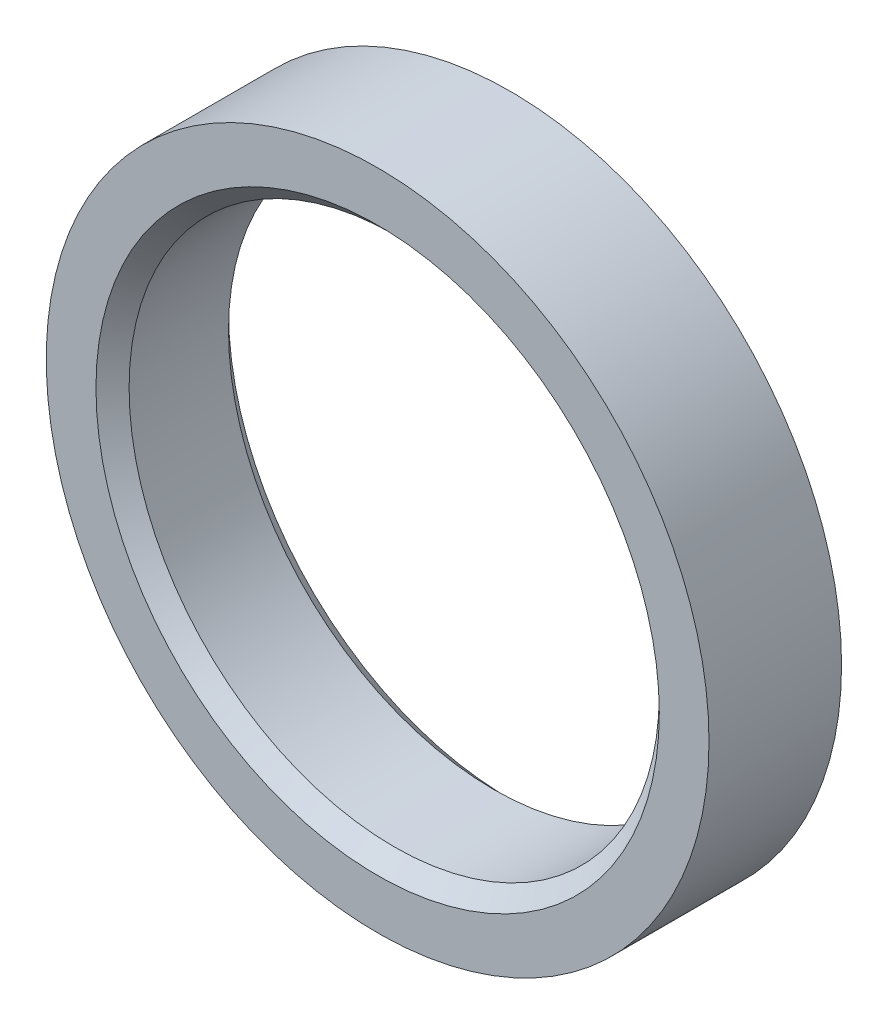
ISO-10303-21;
HEADER;
FILE_DESCRIPTION(('STEP AP214'),'2;1');
FILE_NAME('part.step','',(''),(''),'','','');
FILE_SCHEMA(('AUTOMOTIVE_DESIGN { 1 0 10303 214 1 1 1 1 }'));
ENDSEC;
DATA;
#1=APPLICATION_CONTEXT('core data for automotive mechanical design processes');
#2=APPLICATION_PROTOCOL_DEFINITION('international standard','automotive_design',2000,#1);
#3=PRODUCT_CONTEXT('',#1,'mechanical');
#4=PRODUCT('Part','Part','',(#3));
#5=PRODUCT_RELATED_PRODUCT_CATEGORY('part','',(#4));
#6=PRODUCT_DEFINITION_FORMATION('','',#4);
#7=PRODUCT_DEFINITION_CONTEXT('part definition',#1,'design');
#8=PRODUCT_DEFINITION('design','',#6,#7);
#9=PRODUCT_DEFINITION_SHAPE('','',#8);
#10=(LENGTH_UNIT() NAMED_UNIT(*) SI_UNIT(.MILLI.,.METRE.));
#11=(NAMED_UNIT(*) PLANE_ANGLE_UNIT() SI_UNIT($,.RADIAN.));
#12=(NAMED_UNIT(*) SI_UNIT($,.STERADIAN.) SOLID_ANGLE_UNIT());
#13=UNCERTAINTY_MEASURE_WITH_UNIT(LENGTH_MEASURE(1.E-05),#10,'distance_accuracy_value','');
#14=(GEOMETRIC_REPRESENTATION_CONTEXT(3) GLOBAL_UNCERTAINTY_ASSIGNED_CONTEXT((#13)) GLOBAL_UNIT_ASSIGNED_CONTEXT((#10,
#11,#12)) REPRESENTATION_CONTEXT('',''));
#15=CARTESIAN_POINT('',(0.,0.,0.));
#16=DIRECTION('',(0.,0.,1.));
#17=DIRECTION('',(1.,0.,0.));
#18=AXIS2_PLACEMENT_3D('',#15,#16,#17);
#19=CARTESIAN_POINT('',(0.,0.,8.));
#20=DIRECTION('',(0.,0.,1.));
#21=DIRECTION('',(1.,0.,0.));
#22=AXIS2_PLACEMENT_3D('',#19,#20,#21);
#23=PLANE('',#22);
#24=CARTESIAN_POINT('',(0.,0.,8.));
#25=DIRECTION('',(0.,0.,1.));
#26=DIRECTION('',(1.,0.,0.));
#27=AXIS2_PLACEMENT_3D('',#24,#25,#26);
#28=CIRCLE('',#27,17.);
#29=CARTESIAN_POINT('',(17.,0.,8.));
#30=VERTEX_POINT('',#29);
#31=EDGE_CURVE('E10',#30,#30,#28,.F.);
#32=ORIENTED_EDGE('',*,*,#31,.T.);
#33=EDGE_LOOP('',(#32));
#34=FACE_BOUND('',#33,.T.);
#35=CARTESIAN_POINT('',(0.,0.,8.));
#36=DIRECTION('',(0.,0.,1.));
#37=DIRECTION('',(1.,0.,0.));
#38=AXIS2_PLACEMENT_3D('',#35,#36,#37);
#39=CIRCLE('',#38,20.);
#40=CARTESIAN_POINT('',(20.,0.,8.));
#41=VERTEX_POINT('',#40);
#42=EDGE_CURVE('E64',#41,#41,#39,.T.);
#43=ORIENTED_EDGE('',*,*,#42,.T.);
#44=EDGE_LOOP('',(#43));
#45=FACE_BOUND('',#44,.T.);
#46=ADVANCED_FACE('F39',(#34,#45),#23,.T.);
#47=CARTESIAN_POINT('',(0.,0.,0.));
#48=DIRECTION('',(0.,0.,1.));
#49=DIRECTION('',(1.,0.,0.));
#50=AXIS2_PLACEMENT_3D('',#47,#48,#49);
#51=PLANE('',#50);
#52=CARTESIAN_POINT('',(0.,0.,0.));
#53=DIRECTION('',(0.,0.,1.));
#54=DIRECTION('',(1.,0.,0.));
#55=AXIS2_PLACEMENT_3D('',#52,#53,#54);
#56=CIRCLE('',#55,17.);
#57=CARTESIAN_POINT('',(17.,0.,0.));
#58=VERTEX_POINT('',#57);
#59=EDGE_CURVE('E58',#58,#58,#56,.T.);
#60=ORIENTED_EDGE('',*,*,#59,.T.);
#61=EDGE_LOOP('',(#60));
#62=FACE_BOUND('',#61,.T.);
#63=CARTESIAN_POINT('',(0.,0.,0.));
#64=DIRECTION('',(0.,0.,1.));
#65=DIRECTION('',(1.,0.,0.));
#66=AXIS2_PLACEMENT_3D('',#63,#64,#65);
#67=CIRCLE('',#66,20.);
#68=CARTESIAN_POINT('',(20.,0.,0.));
#69=VERTEX_POINT('',#68);
#70=EDGE_CURVE('E65',#69,#69,#67,.T.);
#71=ORIENTED_EDGE('',*,*,#70,.F.);
#72=EDGE_LOOP('',(#71));
#73=FACE_BOUND('',#72,.T.);
#74=ADVANCED_FACE('F78',(#62,#73),#51,.F.);
#75=CARTESIAN_POINT('',(0.,0.,8.));
#76=DIRECTION('',(0.,0.,-1.));
#77=DIRECTION('',(-1.,0.,0.));
#78=AXIS2_PLACEMENT_3D('',#75,#76,#77);
#79=CYLINDRICAL_SURFACE('',#78,20.);
#80=ORIENTED_EDGE('',*,*,#42,.F.);
#81=EDGE_LOOP('',(#80));
#82=FACE_BOUND('',#81,.T.);
#83=ORIENTED_EDGE('',*,*,#70,.T.);
#84=EDGE_LOOP('',(#83));
#85=FACE_BOUND('',#84,.T.);
#86=ADVANCED_FACE('F74',(#82,#85),#79,.T.);
#87=CARTESIAN_POINT('',(0.,0.,8.));
#88=DIRECTION('',(0.,0.,-1.));
#89=DIRECTION('',(-1.,0.,0.));
#90=AXIS2_PLACEMENT_3D('',#87,#88,#89);
#91=CYLINDRICAL_SURFACE('',#90,16.);
#92=CARTESIAN_POINT('',(0.,0.,0.999999999999997));
#93=DIRECTION('',(0.,0.,1.));
#94=DIRECTION('',(1.,0.,0.));
#95=AXIS2_PLACEMENT_3D('',#92,#93,#94);
#96=CIRCLE('',#95,16.);
#97=CARTESIAN_POINT('',(16.,0.,0.999999999999997));
#98=VERTEX_POINT('',#97);
#99=EDGE_CURVE('E48',#98,#98,#96,.F.);
#100=ORIENTED_EDGE('',*,*,#99,.T.);
#101=EDGE_LOOP('',(#100));
#102=FACE_BOUND('',#101,.T.);
#103=CARTESIAN_POINT('',(0.,0.,7.));
#104=DIRECTION('',(0.,0.,1.));
#105=DIRECTION('',(1.,0.,0.));
#106=AXIS2_PLACEMENT_3D('',#103,#104,#105);
#107=CIRCLE('',#106,16.);
#108=CARTESIAN_POINT('',(16.,0.,7.));
#109=VERTEX_POINT('',#108);
#110=EDGE_CURVE('E53',#109,#109,#107,.T.);
#111=ORIENTED_EDGE('',*,*,#110,.T.);
#112=EDGE_LOOP('',(#111));
#113=FACE_BOUND('',#112,.T.);
#114=ADVANCED_FACE('F77',(#102,#113),#91,.F.);
#115=CARTESIAN_POINT('',(0.,0.,0.));
#116=DIRECTION('',(0.,0.,-1.));
#117=DIRECTION('',(-1.,0.,0.));
#118=AXIS2_PLACEMENT_3D('',#115,#116,#117);
#119=CONICAL_SURFACE('',#118,17.,0.785398163397447);
#120=ORIENTED_EDGE('',*,*,#99,.F.);
#121=EDGE_LOOP('',(#120));
#122=FACE_BOUND('',#121,.T.);
#123=ORIENTED_EDGE('',*,*,#59,.F.);
#124=EDGE_LOOP('',(#123));
#125=FACE_BOUND('',#124,.T.);
#126=ADVANCED_FACE('F91',(#122,#125),#119,.F.);
#127=CARTESIAN_POINT('',(0.,0.,7.));
#128=DIRECTION('',(0.,0.,1.));
#129=DIRECTION('',(1.,0.,0.));
#130=AXIS2_PLACEMENT_3D('',#127,#128,#129);
#131=CONICAL_SURFACE('',#130,16.,0.785398163397448);
#132=ORIENTED_EDGE('',*,*,#31,.F.);
#133=EDGE_LOOP('',(#132));
#134=FACE_BOUND('',#133,.T.);
#135=ORIENTED_EDGE('',*,*,#110,.F.);
#136=EDGE_LOOP('',(#135));
#137=FACE_BOUND('',#136,.T.);
#138=ADVANCED_FACE('F42',(#134,#137),#131,.F.);
#139=CLOSED_SHELL('',(#46,#74,#86,#114,#126,#138));
#140=MANIFOLD_SOLID_BREP('B2',#139);
#141=ADVANCED_BREP_SHAPE_REPRESENTATION('',(#18,#140),#14);
#142=SHAPE_DEFINITION_REPRESENTATION(#9,#141);
ENDSEC;
END-ISO-10303-21;
